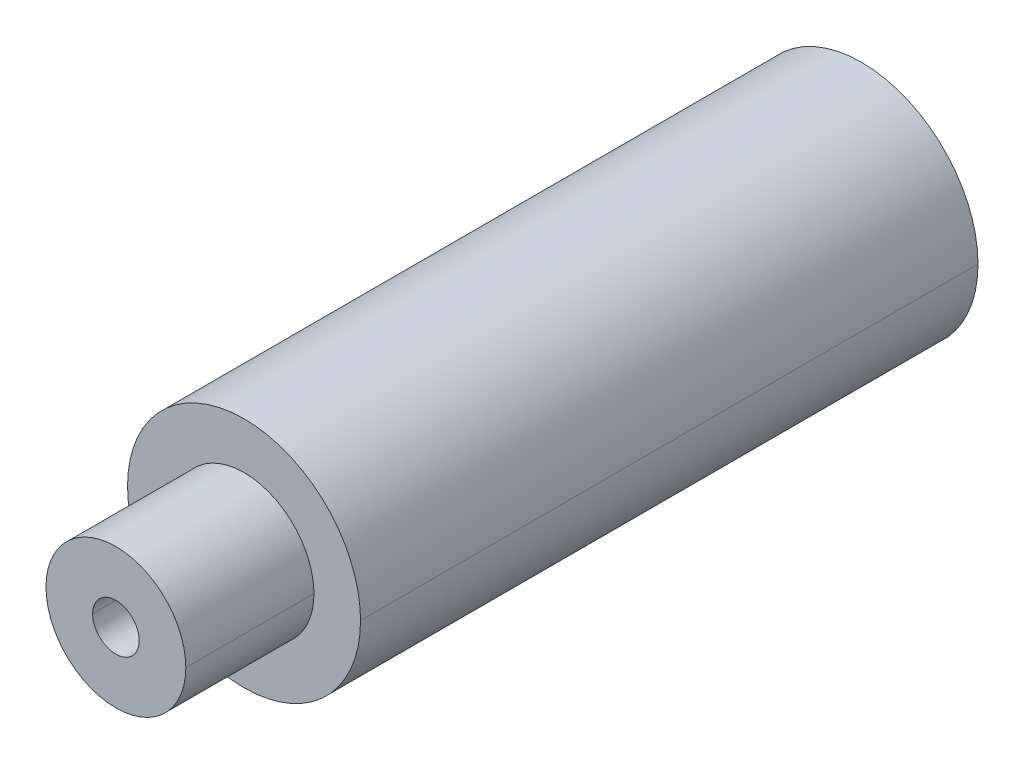
ISO-10303-21;
HEADER;
FILE_DESCRIPTION(('STEP AP214'),'2;1');
FILE_NAME('part.step','',(''),(''),'','','');
FILE_SCHEMA(('AUTOMOTIVE_DESIGN { 1 0 10303 214 1 1 1 1 }'));
ENDSEC;
DATA;
#1=APPLICATION_CONTEXT('core data for automotive mechanical design processes');
#2=APPLICATION_PROTOCOL_DEFINITION('international standard','automotive_design',2000,#1);
#3=PRODUCT_CONTEXT('',#1,'mechanical');
#4=PRODUCT('Part','Part','',(#3));
#5=PRODUCT_RELATED_PRODUCT_CATEGORY('part','',(#4));
#6=PRODUCT_DEFINITION_FORMATION('','',#4);
#7=PRODUCT_DEFINITION_CONTEXT('part definition',#1,'design');
#8=PRODUCT_DEFINITION('design','',#6,#7);
#9=PRODUCT_DEFINITION_SHAPE('','',#8);
#10=(LENGTH_UNIT() NAMED_UNIT(*) SI_UNIT(.MILLI.,.METRE.));
#11=(NAMED_UNIT(*) PLANE_ANGLE_UNIT() SI_UNIT($,.RADIAN.));
#12=(NAMED_UNIT(*) SI_UNIT($,.STERADIAN.) SOLID_ANGLE_UNIT());
#13=UNCERTAINTY_MEASURE_WITH_UNIT(LENGTH_MEASURE(1.E-05),#10,'distance_accuracy_value','');
#14=(GEOMETRIC_REPRESENTATION_CONTEXT(3) GLOBAL_UNCERTAINTY_ASSIGNED_CONTEXT((#13)) GLOBAL_UNIT_ASSIGNED_CONTEXT((#10,
#11,#12)) REPRESENTATION_CONTEXT('',''));
#15=CARTESIAN_POINT('',(0.,0.,0.));
#16=DIRECTION('',(0.,0.,1.));
#17=DIRECTION('',(1.,0.,0.));
#18=AXIS2_PLACEMENT_3D('',#15,#16,#17);
#19=CARTESIAN_POINT('',(0.,1.,29.));
#20=DIRECTION('',(0.,0.,-1.));
#21=DIRECTION('',(0.,-1.,0.));
#22=AXIS2_PLACEMENT_3D('',#19,#20,#21);
#23=PLANE('',#22);
#24=CARTESIAN_POINT('',(0.,0.,29.));
#25=DIRECTION('',(0.,0.,1.));
#26=DIRECTION('',(1.,0.,0.));
#27=AXIS2_PLACEMENT_3D('',#24,#25,#26);
#28=CIRCLE('',#27,1.);
#29=CARTESIAN_POINT('',(1.,0.,29.));
#30=VERTEX_POINT('',#29);
#31=CARTESIAN_POINT('',(-1.,0.,29.));
#32=VERTEX_POINT('',#31);
#33=EDGE_CURVE('E11',#30,#32,#28,.T.);
#34=ORIENTED_EDGE('',*,*,#33,.T.);
#35=CARTESIAN_POINT('',(0.,0.,29.));
#36=DIRECTION('',(0.,0.,1.));
#37=DIRECTION('',(1.,0.,0.));
#38=AXIS2_PLACEMENT_3D('',#35,#36,#37);
#39=CIRCLE('',#38,1.);
#40=EDGE_CURVE('E158',#32,#30,#39,.T.);
#41=ORIENTED_EDGE('',*,*,#40,.T.);
#42=EDGE_LOOP('',(#34,#41));
#43=FACE_BOUND('',#42,.T.);
#44=ADVANCED_FACE('F16',(#43),#23,.F.);
#45=CARTESIAN_POINT('',(0.,0.,29.));
#46=DIRECTION('',(0.,0.,1.));
#47=DIRECTION('',(1.,0.,0.));
#48=AXIS2_PLACEMENT_3D('',#45,#46,#47);
#49=CYLINDRICAL_SURFACE('',#48,1.);
#50=DIRECTION('',(0.,0.,1.));
#51=VECTOR('',#50,1.);
#52=CARTESIAN_POINT('',(-1.,0.,29.));
#53=LINE('',#52,#51);
#54=CARTESIAN_POINT('',(-1.,0.,32.));
#55=VERTEX_POINT('',#54);
#56=EDGE_CURVE('E148',#32,#55,#53,.T.);
#57=ORIENTED_EDGE('',*,*,#56,.F.);
#58=ORIENTED_EDGE('',*,*,#33,.F.);
#59=DIRECTION('',(0.,0.,1.));
#60=VECTOR('',#59,1.);
#61=CARTESIAN_POINT('',(1.,0.,29.));
#62=LINE('',#61,#60);
#63=CARTESIAN_POINT('',(1.,0.,32.));
#64=VERTEX_POINT('',#63);
#65=EDGE_CURVE('E110',#30,#64,#62,.T.);
#66=ORIENTED_EDGE('',*,*,#65,.T.);
#67=CARTESIAN_POINT('',(0.,0.,32.));
#68=DIRECTION('',(0.,0.,1.));
#69=DIRECTION('',(1.,0.,0.));
#70=AXIS2_PLACEMENT_3D('',#67,#68,#69);
#71=CIRCLE('',#70,1.);
#72=EDGE_CURVE('E24',#64,#55,#71,.T.);
#73=ORIENTED_EDGE('',*,*,#72,.T.);
#74=EDGE_LOOP('',(#57,#58,#66,#73));
#75=FACE_BOUND('',#74,.T.);
#76=ADVANCED_FACE('F146',(#75),#49,.F.);
#77=CARTESIAN_POINT('',(0.,3.,32.));
#78=DIRECTION('',(0.,0.,-1.));
#79=DIRECTION('',(0.,-1.,0.));
#80=AXIS2_PLACEMENT_3D('',#77,#78,#79);
#81=PLANE('',#80);
#82=ORIENTED_EDGE('',*,*,#72,.F.);
#83=CARTESIAN_POINT('',(0.,0.,32.));
#84=DIRECTION('',(0.,0.,1.));
#85=DIRECTION('',(1.,0.,0.));
#86=AXIS2_PLACEMENT_3D('',#83,#84,#85);
#87=CIRCLE('',#86,1.);
#88=EDGE_CURVE('E119',#55,#64,#87,.T.);
#89=ORIENTED_EDGE('',*,*,#88,.F.);
#90=EDGE_LOOP('',(#82,#89));
#91=FACE_BOUND('',#90,.T.);
#92=CARTESIAN_POINT('',(0.,0.,32.));
#93=DIRECTION('',(0.,0.,1.));
#94=DIRECTION('',(1.,0.,0.));
#95=AXIS2_PLACEMENT_3D('',#92,#93,#94);
#96=CIRCLE('',#95,3.);
#97=CARTESIAN_POINT('',(3.,0.,32.));
#98=VERTEX_POINT('',#97);
#99=CARTESIAN_POINT('',(-3.,0.,32.));
#100=VERTEX_POINT('',#99);
#101=EDGE_CURVE('E104',#98,#100,#96,.T.);
#102=ORIENTED_EDGE('',*,*,#101,.T.);
#103=CARTESIAN_POINT('',(0.,0.,32.));
#104=DIRECTION('',(0.,0.,1.));
#105=DIRECTION('',(1.,0.,0.));
#106=AXIS2_PLACEMENT_3D('',#103,#104,#105);
#107=CIRCLE('',#106,3.);
#108=EDGE_CURVE('E98',#100,#98,#107,.T.);
#109=ORIENTED_EDGE('',*,*,#108,.T.);
#110=EDGE_LOOP('',(#102,#109));
#111=FACE_BOUND('',#110,.T.);
#112=ADVANCED_FACE('F153',(#91,#111),#81,.F.);
#113=CARTESIAN_POINT('',(0.,0.,29.));
#114=DIRECTION('',(0.,0.,1.));
#115=DIRECTION('',(1.,0.,0.));
#116=AXIS2_PLACEMENT_3D('',#113,#114,#115);
#117=CYLINDRICAL_SURFACE('',#116,3.);
#118=DIRECTION('',(0.,0.,1.));
#119=VECTOR('',#118,1.);
#120=CARTESIAN_POINT('',(-3.,0.,29.));
#121=LINE('',#120,#119);
#122=CARTESIAN_POINT('',(-3.,0.,26.5));
#123=VERTEX_POINT('',#122);
#124=EDGE_CURVE('E93',#123,#100,#121,.T.);
#125=ORIENTED_EDGE('',*,*,#124,.F.);
#126=CARTESIAN_POINT('',(0.,0.,26.5));
#127=DIRECTION('',(0.,0.,1.));
#128=DIRECTION('',(1.,0.,0.));
#129=AXIS2_PLACEMENT_3D('',#126,#127,#128);
#130=CIRCLE('',#129,3.);
#131=CARTESIAN_POINT('',(3.,0.,26.5));
#132=VERTEX_POINT('',#131);
#133=EDGE_CURVE('E87',#123,#132,#130,.T.);
#134=ORIENTED_EDGE('',*,*,#133,.T.);
#135=DIRECTION('',(0.,0.,1.));
#136=VECTOR('',#135,1.);
#137=CARTESIAN_POINT('',(3.,0.,29.));
#138=LINE('',#137,#136);
#139=EDGE_CURVE('E90',#132,#98,#138,.T.);
#140=ORIENTED_EDGE('',*,*,#139,.T.);
#141=ORIENTED_EDGE('',*,*,#108,.F.);
#142=EDGE_LOOP('',(#125,#134,#140,#141));
#143=FACE_BOUND('',#142,.T.);
#144=ADVANCED_FACE('F89',(#143),#117,.T.);
#145=CARTESIAN_POINT('',(0.,5.,26.5));
#146=DIRECTION('',(0.,0.,-1.));
#147=DIRECTION('',(0.,-1.,0.));
#148=AXIS2_PLACEMENT_3D('',#145,#146,#147);
#149=PLANE('',#148);
#150=CARTESIAN_POINT('',(0.,0.,26.5));
#151=DIRECTION('',(0.,0.,1.));
#152=DIRECTION('',(1.,0.,0.));
#153=AXIS2_PLACEMENT_3D('',#150,#151,#152);
#154=CIRCLE('',#153,3.);
#155=EDGE_CURVE('E102',#132,#123,#154,.T.);
#156=ORIENTED_EDGE('',*,*,#155,.F.);
#157=ORIENTED_EDGE('',*,*,#133,.F.);
#158=EDGE_LOOP('',(#156,#157));
#159=FACE_BOUND('',#158,.T.);
#160=CARTESIAN_POINT('',(0.,0.,26.5));
#161=DIRECTION('',(0.,0.,1.));
#162=DIRECTION('',(1.,0.,0.));
#163=AXIS2_PLACEMENT_3D('',#160,#161,#162);
#164=CIRCLE('',#163,5.);
#165=CARTESIAN_POINT('',(5.,0.,26.5));
#166=VERTEX_POINT('',#165);
#167=CARTESIAN_POINT('',(-5.,0.,26.5));
#168=VERTEX_POINT('',#167);
#169=EDGE_CURVE('E127',#166,#168,#164,.T.);
#170=ORIENTED_EDGE('',*,*,#169,.T.);
#171=CARTESIAN_POINT('',(0.,0.,26.5));
#172=DIRECTION('',(0.,0.,1.));
#173=DIRECTION('',(1.,0.,0.));
#174=AXIS2_PLACEMENT_3D('',#171,#172,#173);
#175=CIRCLE('',#174,5.);
#176=EDGE_CURVE('E36',#168,#166,#175,.T.);
#177=ORIENTED_EDGE('',*,*,#176,.T.);
#178=EDGE_LOOP('',(#170,#177));
#179=FACE_BOUND('',#178,.T.);
#180=ADVANCED_FACE('F108',(#159,#179),#149,.F.);
#181=CARTESIAN_POINT('',(0.,0.,29.));
#182=DIRECTION('',(0.,0.,1.));
#183=DIRECTION('',(1.,0.,0.));
#184=AXIS2_PLACEMENT_3D('',#181,#182,#183);
#185=CYLINDRICAL_SURFACE('',#184,5.);
#186=DIRECTION('',(0.,0.,1.));
#187=VECTOR('',#186,1.);
#188=CARTESIAN_POINT('',(-5.,0.,29.));
#189=LINE('',#188,#187);
#190=CARTESIAN_POINT('',(-5.,0.,0.));
#191=VERTEX_POINT('',#190);
#192=EDGE_CURVE('E134',#191,#168,#189,.T.);
#193=ORIENTED_EDGE('',*,*,#192,.F.);
#194=CARTESIAN_POINT('',(0.,0.,0.));
#195=DIRECTION('',(0.,0.,1.));
#196=DIRECTION('',(1.,0.,0.));
#197=AXIS2_PLACEMENT_3D('',#194,#195,#196);
#198=CIRCLE('',#197,5.);
#199=CARTESIAN_POINT('',(5.,0.,0.));
#200=VERTEX_POINT('',#199);
#201=EDGE_CURVE('E126',#191,#200,#198,.T.);
#202=ORIENTED_EDGE('',*,*,#201,.T.);
#203=DIRECTION('',(0.,0.,1.));
#204=VECTOR('',#203,1.);
#205=CARTESIAN_POINT('',(5.,0.,29.));
#206=LINE('',#205,#204);
#207=EDGE_CURVE('E124',#200,#166,#206,.T.);
#208=ORIENTED_EDGE('',*,*,#207,.T.);
#209=ORIENTED_EDGE('',*,*,#176,.F.);
#210=EDGE_LOOP('',(#193,#202,#208,#209));
#211=FACE_BOUND('',#210,.T.);
#212=ADVANCED_FACE('F174',(#211),#185,.T.);
#213=CARTESIAN_POINT('',(0.,0.,0.));
#214=DIRECTION('',(0.,0.,1.));
#215=DIRECTION('',(1.,0.,0.));
#216=AXIS2_PLACEMENT_3D('',#213,#214,#215);
#217=PLANE('',#216);
#218=CARTESIAN_POINT('',(0.,0.,0.));
#219=DIRECTION('',(0.,0.,1.));
#220=DIRECTION('',(1.,0.,0.));
#221=AXIS2_PLACEMENT_3D('',#218,#219,#220);
#222=CIRCLE('',#221,5.);
#223=EDGE_CURVE('E106',#200,#191,#222,.T.);
#224=ORIENTED_EDGE('',*,*,#223,.F.);
#225=ORIENTED_EDGE('',*,*,#201,.F.);
#226=EDGE_LOOP('',(#224,#225));
#227=FACE_BOUND('',#226,.T.);
#228=ADVANCED_FACE('F176',(#227),#217,.F.);
#229=CARTESIAN_POINT('',(0.,0.,29.));
#230=DIRECTION('',(0.,0.,1.));
#231=DIRECTION('',(1.,0.,0.));
#232=AXIS2_PLACEMENT_3D('',#229,#230,#231);
#233=CYLINDRICAL_SURFACE('',#232,5.);
#234=ORIENTED_EDGE('',*,*,#223,.T.);
#235=ORIENTED_EDGE('',*,*,#192,.T.);
#236=ORIENTED_EDGE('',*,*,#169,.F.);
#237=ORIENTED_EDGE('',*,*,#207,.F.);
#238=EDGE_LOOP('',(#234,#235,#236,#237));
#239=FACE_BOUND('',#238,.T.);
#240=ADVANCED_FACE('F171',(#239),#233,.T.);
#241=CARTESIAN_POINT('',(0.,0.,29.));
#242=DIRECTION('',(0.,0.,1.));
#243=DIRECTION('',(1.,0.,0.));
#244=AXIS2_PLACEMENT_3D('',#241,#242,#243);
#245=CYLINDRICAL_SURFACE('',#244,3.);
#246=ORIENTED_EDGE('',*,*,#155,.T.);
#247=ORIENTED_EDGE('',*,*,#124,.T.);
#248=ORIENTED_EDGE('',*,*,#101,.F.);
#249=ORIENTED_EDGE('',*,*,#139,.F.);
#250=EDGE_LOOP('',(#246,#247,#248,#249));
#251=FACE_BOUND('',#250,.T.);
#252=ADVANCED_FACE('F101',(#251),#245,.T.);
#253=CARTESIAN_POINT('',(0.,0.,29.));
#254=DIRECTION('',(0.,0.,1.));
#255=DIRECTION('',(1.,0.,0.));
#256=AXIS2_PLACEMENT_3D('',#253,#254,#255);
#257=CYLINDRICAL_SURFACE('',#256,1.);
#258=ORIENTED_EDGE('',*,*,#40,.F.);
#259=ORIENTED_EDGE('',*,*,#56,.T.);
#260=ORIENTED_EDGE('',*,*,#88,.T.);
#261=ORIENTED_EDGE('',*,*,#65,.F.);
#262=EDGE_LOOP('',(#258,#259,#260,#261));
#263=FACE_BOUND('',#262,.T.);
#264=ADVANCED_FACE('F156',(#263),#257,.F.);
#265=CLOSED_SHELL('',(#44,#76,#112,#144,#180,#212,#228,#240,#252,#264));
#266=MANIFOLD_SOLID_BREP('B1',#265);
#267=ADVANCED_BREP_SHAPE_REPRESENTATION('',(#18,#266),#14);
#268=SHAPE_DEFINITION_REPRESENTATION(#9,#267);
ENDSEC;
END-ISO-10303-21;
